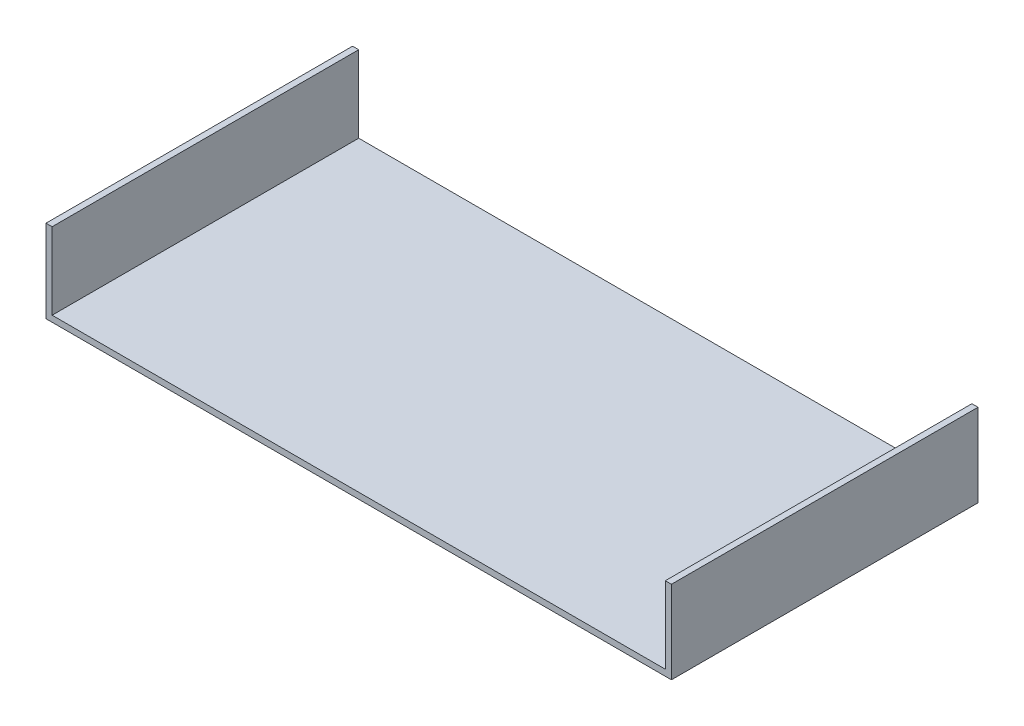
ISO-10303-21;
HEADER;
FILE_DESCRIPTION(('STEP AP214'),'2;1');
FILE_NAME('part.step','',(''),(''),'','','');
FILE_SCHEMA(('AUTOMOTIVE_DESIGN { 1 0 10303 214 1 1 1 1 }'));
ENDSEC;
DATA;
#1=APPLICATION_CONTEXT('core data for automotive mechanical design processes');
#2=APPLICATION_PROTOCOL_DEFINITION('international standard','automotive_design',2000,#1);
#3=PRODUCT_CONTEXT('',#1,'mechanical');
#4=PRODUCT('Part','Part','',(#3));
#5=PRODUCT_RELATED_PRODUCT_CATEGORY('part','',(#4));
#6=PRODUCT_DEFINITION_FORMATION('','',#4);
#7=PRODUCT_DEFINITION_CONTEXT('part definition',#1,'design');
#8=PRODUCT_DEFINITION('design','',#6,#7);
#9=PRODUCT_DEFINITION_SHAPE('','',#8);
#10=(LENGTH_UNIT() NAMED_UNIT(*) SI_UNIT(.MILLI.,.METRE.));
#11=(NAMED_UNIT(*) PLANE_ANGLE_UNIT() SI_UNIT($,.RADIAN.));
#12=(NAMED_UNIT(*) SI_UNIT($,.STERADIAN.) SOLID_ANGLE_UNIT());
#13=UNCERTAINTY_MEASURE_WITH_UNIT(LENGTH_MEASURE(1.E-05),#10,'distance_accuracy_value','');
#14=(GEOMETRIC_REPRESENTATION_CONTEXT(3) GLOBAL_UNCERTAINTY_ASSIGNED_CONTEXT((#13)) GLOBAL_UNIT_ASSIGNED_CONTEXT((#10,
#11,#12)) REPRESENTATION_CONTEXT('',''));
#15=CARTESIAN_POINT('',(0.,0.,0.));
#16=DIRECTION('',(0.,0.,1.));
#17=DIRECTION('',(1.,0.,0.));
#18=AXIS2_PLACEMENT_3D('',#15,#16,#17);
#19=CARTESIAN_POINT('',(-200.,0.,-10000.));
#20=DIRECTION('',(0.,1.,0.));
#21=DIRECTION('',(0.,0.,1.));
#22=AXIS2_PLACEMENT_3D('',#19,#20,#21);
#23=PLANE('',#22);
#24=DIRECTION('',(-1.,0.,0.));
#25=VECTOR('',#24,1.);
#26=CARTESIAN_POINT('',(-200.,0.,0.));
#27=LINE('',#26,#25);
#28=CARTESIAN_POINT('',(0.,0.,0.));
#29=VERTEX_POINT('',#28);
#30=CARTESIAN_POINT('',(-200.,0.,0.));
#31=VERTEX_POINT('',#30);
#32=EDGE_CURVE('E146',#29,#31,#27,.T.);
#33=ORIENTED_EDGE('',*,*,#32,.F.);
#34=DIRECTION('',(0.,0.,1.));
#35=VECTOR('',#34,1.);
#36=CARTESIAN_POINT('',(0.,0.,-10000.));
#37=LINE('',#36,#35);
#38=CARTESIAN_POINT('',(0.,0.,-10000.));
#39=VERTEX_POINT('',#38);
#40=EDGE_CURVE('E11',#39,#29,#37,.T.);
#41=ORIENTED_EDGE('',*,*,#40,.F.);
#42=DIRECTION('',(-1.,0.,0.));
#43=VECTOR('',#42,1.);
#44=CARTESIAN_POINT('',(-200.,0.,-10000.));
#45=LINE('',#44,#43);
#46=CARTESIAN_POINT('',(-200.,0.,-10000.));
#47=VERTEX_POINT('',#46);
#48=EDGE_CURVE('E174',#39,#47,#45,.T.);
#49=ORIENTED_EDGE('',*,*,#48,.T.);
#50=DIRECTION('',(0.,0.,1.));
#51=VECTOR('',#50,1.);
#52=CARTESIAN_POINT('',(-200.,0.,-10000.));
#53=LINE('',#52,#51);
#54=EDGE_CURVE('E46',#47,#31,#53,.T.);
#55=ORIENTED_EDGE('',*,*,#54,.T.);
#56=EDGE_LOOP('',(#33,#41,#49,#55));
#57=FACE_BOUND('',#56,.T.);
#58=ADVANCED_FACE('F43',(#57),#23,.T.);
#59=CARTESIAN_POINT('',(0.,0.,-10000.));
#60=DIRECTION('',(1.,0.,0.));
#61=DIRECTION('',(0.,1.,0.));
#62=AXIS2_PLACEMENT_3D('',#59,#60,#61);
#63=PLANE('',#62);
#64=DIRECTION('',(0.,1.,0.));
#65=VECTOR('',#64,1.);
#66=CARTESIAN_POINT('',(0.,0.,0.));
#67=LINE('',#66,#65);
#68=CARTESIAN_POINT('',(3.06161699786838E-13,-2500.,0.));
#69=VERTEX_POINT('',#68);
#70=EDGE_CURVE('E171',#69,#29,#67,.T.);
#71=ORIENTED_EDGE('',*,*,#70,.F.);
#72=DIRECTION('',(0.,0.,1.));
#73=VECTOR('',#72,1.);
#74=CARTESIAN_POINT('',(3.06161699786838E-13,-2500.,-10000.));
#75=LINE('',#74,#73);
#76=CARTESIAN_POINT('',(3.06161699786838E-13,-2500.,-10000.));
#77=VERTEX_POINT('',#76);
#78=EDGE_CURVE('E53',#77,#69,#75,.T.);
#79=ORIENTED_EDGE('',*,*,#78,.F.);
#80=DIRECTION('',(0.,1.,0.));
#81=VECTOR('',#80,1.);
#82=CARTESIAN_POINT('',(0.,0.,-10000.));
#83=LINE('',#82,#81);
#84=EDGE_CURVE('E132',#77,#39,#83,.T.);
#85=ORIENTED_EDGE('',*,*,#84,.T.);
#86=ORIENTED_EDGE('',*,*,#40,.T.);
#87=EDGE_LOOP('',(#71,#79,#85,#86));
#88=FACE_BOUND('',#87,.T.);
#89=ADVANCED_FACE('F192',(#88),#63,.T.);
#90=CARTESIAN_POINT('',(3.06161699786838E-13,-2500.,-10000.));
#91=DIRECTION('',(0.,1.,0.));
#92=DIRECTION('',(0.,0.,1.));
#93=AXIS2_PLACEMENT_3D('',#90,#91,#92);
#94=PLANE('',#93);
#95=DIRECTION('',(-1.,0.,0.));
#96=VECTOR('',#95,1.);
#97=CARTESIAN_POINT('',(3.06161699786838E-13,-2500.,0.));
#98=LINE('',#97,#96);
#99=CARTESIAN_POINT('',(20000.,-2500.,0.));
#100=VERTEX_POINT('',#99);
#101=EDGE_CURVE('E118',#100,#69,#98,.T.);
#102=ORIENTED_EDGE('',*,*,#101,.F.);
#103=DIRECTION('',(0.,0.,1.));
#104=VECTOR('',#103,1.);
#105=CARTESIAN_POINT('',(20000.,-2500.,-10000.));
#106=LINE('',#105,#104);
#107=CARTESIAN_POINT('',(20000.,-2500.,-10000.));
#108=VERTEX_POINT('',#107);
#109=EDGE_CURVE('E113',#108,#100,#106,.T.);
#110=ORIENTED_EDGE('',*,*,#109,.F.);
#111=DIRECTION('',(-1.,0.,0.));
#112=VECTOR('',#111,1.);
#113=CARTESIAN_POINT('',(3.06161699786838E-13,-2500.,-10000.));
#114=LINE('',#113,#112);
#115=EDGE_CURVE('E116',#108,#77,#114,.T.);
#116=ORIENTED_EDGE('',*,*,#115,.T.);
#117=ORIENTED_EDGE('',*,*,#78,.T.);
#118=EDGE_LOOP('',(#102,#110,#116,#117));
#119=FACE_BOUND('',#118,.T.);
#120=ADVANCED_FACE('F115',(#119),#94,.T.);
#121=CARTESIAN_POINT('',(20000.,-2500.,-10000.));
#122=DIRECTION('',(-1.,0.,0.));
#123=DIRECTION('',(0.,0.,1.));
#124=AXIS2_PLACEMENT_3D('',#121,#122,#123);
#125=PLANE('',#124);
#126=DIRECTION('',(0.,-1.,0.));
#127=VECTOR('',#126,1.);
#128=CARTESIAN_POINT('',(20000.,-2500.,0.));
#129=LINE('',#128,#127);
#130=CARTESIAN_POINT('',(20000.,0.,0.));
#131=VERTEX_POINT('',#130);
#132=EDGE_CURVE('E166',#131,#100,#129,.T.);
#133=ORIENTED_EDGE('',*,*,#132,.F.);
#134=DIRECTION('',(0.,0.,1.));
#135=VECTOR('',#134,1.);
#136=CARTESIAN_POINT('',(20000.,0.,-10000.));
#137=LINE('',#136,#135);
#138=CARTESIAN_POINT('',(20000.,0.,-10000.));
#139=VERTEX_POINT('',#138);
#140=EDGE_CURVE('E124',#139,#131,#137,.T.);
#141=ORIENTED_EDGE('',*,*,#140,.F.);
#142=DIRECTION('',(0.,-1.,0.));
#143=VECTOR('',#142,1.);
#144=CARTESIAN_POINT('',(20000.,-2500.,-10000.));
#145=LINE('',#144,#143);
#146=EDGE_CURVE('E130',#139,#108,#145,.T.);
#147=ORIENTED_EDGE('',*,*,#146,.T.);
#148=ORIENTED_EDGE('',*,*,#109,.T.);
#149=EDGE_LOOP('',(#133,#141,#147,#148));
#150=FACE_BOUND('',#149,.T.);
#151=ADVANCED_FACE('F135',(#150),#125,.T.);
#152=CARTESIAN_POINT('',(20000.,0.,-10000.));
#153=DIRECTION('',(0.,1.,0.));
#154=DIRECTION('',(0.,0.,1.));
#155=AXIS2_PLACEMENT_3D('',#152,#153,#154);
#156=PLANE('',#155);
#157=DIRECTION('',(-1.,0.,0.));
#158=VECTOR('',#157,1.);
#159=CARTESIAN_POINT('',(20000.,0.,0.));
#160=LINE('',#159,#158);
#161=CARTESIAN_POINT('',(20200.,0.,0.));
#162=VERTEX_POINT('',#161);
#163=EDGE_CURVE('E162',#162,#131,#160,.T.);
#164=ORIENTED_EDGE('',*,*,#163,.F.);
#165=DIRECTION('',(0.,0.,1.));
#166=VECTOR('',#165,1.);
#167=CARTESIAN_POINT('',(20200.,0.,-10000.));
#168=LINE('',#167,#166);
#169=CARTESIAN_POINT('',(20200.,0.,-10000.));
#170=VERTEX_POINT('',#169);
#171=EDGE_CURVE('E180',#170,#162,#168,.T.);
#172=ORIENTED_EDGE('',*,*,#171,.F.);
#173=DIRECTION('',(-1.,0.,0.));
#174=VECTOR('',#173,1.);
#175=CARTESIAN_POINT('',(20000.,0.,-10000.));
#176=LINE('',#175,#174);
#177=EDGE_CURVE('E137',#170,#139,#176,.T.);
#178=ORIENTED_EDGE('',*,*,#177,.T.);
#179=ORIENTED_EDGE('',*,*,#140,.T.);
#180=EDGE_LOOP('',(#164,#172,#178,#179));
#181=FACE_BOUND('',#180,.T.);
#182=ADVANCED_FACE('F205',(#181),#156,.T.);
#183=CARTESIAN_POINT('',(20200.,-2700.,-10000.));
#184=DIRECTION('',(1.,0.,0.));
#185=DIRECTION('',(0.,0.,-1.));
#186=AXIS2_PLACEMENT_3D('',#183,#184,#185);
#187=PLANE('',#186);
#188=DIRECTION('',(0.,1.,0.));
#189=VECTOR('',#188,1.);
#190=CARTESIAN_POINT('',(20200.,-2700.,0.));
#191=LINE('',#190,#189);
#192=CARTESIAN_POINT('',(20200.,-2700.,0.));
#193=VERTEX_POINT('',#192);
#194=EDGE_CURVE('E158',#193,#162,#191,.T.);
#195=ORIENTED_EDGE('',*,*,#194,.F.);
#196=DIRECTION('',(0.,0.,1.));
#197=VECTOR('',#196,1.);
#198=CARTESIAN_POINT('',(20200.,-2700.,-10000.));
#199=LINE('',#198,#197);
#200=CARTESIAN_POINT('',(20200.,-2700.,-10000.));
#201=VERTEX_POINT('',#200);
#202=EDGE_CURVE('E183',#201,#193,#199,.T.);
#203=ORIENTED_EDGE('',*,*,#202,.F.);
#204=DIRECTION('',(0.,1.,0.));
#205=VECTOR('',#204,1.);
#206=CARTESIAN_POINT('',(20200.,-2700.,-10000.));
#207=LINE('',#206,#205);
#208=EDGE_CURVE('E140',#201,#170,#207,.T.);
#209=ORIENTED_EDGE('',*,*,#208,.T.);
#210=ORIENTED_EDGE('',*,*,#171,.T.);
#211=EDGE_LOOP('',(#195,#203,#209,#210));
#212=FACE_BOUND('',#211,.T.);
#213=ADVANCED_FACE('F208',(#212),#187,.T.);
#214=CARTESIAN_POINT('',(-199.999999999999,-2700.,-10000.));
#215=DIRECTION('',(0.,-1.,0.));
#216=DIRECTION('',(0.,0.,-1.));
#217=AXIS2_PLACEMENT_3D('',#214,#215,#216);
#218=PLANE('',#217);
#219=DIRECTION('',(1.,0.,0.));
#220=VECTOR('',#219,1.);
#221=CARTESIAN_POINT('',(-199.999999999999,-2700.,0.));
#222=LINE('',#221,#220);
#223=CARTESIAN_POINT('',(-199.999999999999,-2700.,0.));
#224=VERTEX_POINT('',#223);
#225=EDGE_CURVE('E154',#224,#193,#222,.T.);
#226=ORIENTED_EDGE('',*,*,#225,.F.);
#227=DIRECTION('',(0.,0.,1.));
#228=VECTOR('',#227,1.);
#229=CARTESIAN_POINT('',(-199.999999999999,-2700.,-10000.));
#230=LINE('',#229,#228);
#231=CARTESIAN_POINT('',(-199.999999999999,-2700.,-10000.));
#232=VERTEX_POINT('',#231);
#233=EDGE_CURVE('E185',#232,#224,#230,.T.);
#234=ORIENTED_EDGE('',*,*,#233,.F.);
#235=DIRECTION('',(1.,0.,0.));
#236=VECTOR('',#235,1.);
#237=CARTESIAN_POINT('',(-199.999999999999,-2700.,-10000.));
#238=LINE('',#237,#236);
#239=EDGE_CURVE('E303',#232,#201,#238,.T.);
#240=ORIENTED_EDGE('',*,*,#239,.T.);
#241=ORIENTED_EDGE('',*,*,#202,.T.);
#242=EDGE_LOOP('',(#226,#234,#240,#241));
#243=FACE_BOUND('',#242,.T.);
#244=ADVANCED_FACE('F212',(#243),#218,.T.);
#245=CARTESIAN_POINT('',(-200.,0.,-10000.));
#246=DIRECTION('',(-1.,0.,0.));
#247=DIRECTION('',(0.,-1.,0.));
#248=AXIS2_PLACEMENT_3D('',#245,#246,#247);
#249=PLANE('',#248);
#250=DIRECTION('',(0.,-1.,0.));
#251=VECTOR('',#250,1.);
#252=CARTESIAN_POINT('',(-200.,0.,0.));
#253=LINE('',#252,#251);
#254=EDGE_CURVE('E150',#31,#224,#253,.T.);
#255=ORIENTED_EDGE('',*,*,#254,.F.);
#256=ORIENTED_EDGE('',*,*,#54,.F.);
#257=DIRECTION('',(0.,-1.,0.));
#258=VECTOR('',#257,1.);
#259=CARTESIAN_POINT('',(-200.,0.,-10000.));
#260=LINE('',#259,#258);
#261=EDGE_CURVE('E306',#47,#232,#260,.T.);
#262=ORIENTED_EDGE('',*,*,#261,.T.);
#263=ORIENTED_EDGE('',*,*,#233,.T.);
#264=EDGE_LOOP('',(#255,#256,#262,#263));
#265=FACE_BOUND('',#264,.T.);
#266=ADVANCED_FACE('F189',(#265),#249,.T.);
#267=CARTESIAN_POINT('',(0.,0.,-10000.));
#268=DIRECTION('',(0.,0.,-1.));
#269=DIRECTION('',(-1.,0.,0.));
#270=AXIS2_PLACEMENT_3D('',#267,#268,#269);
#271=PLANE('',#270);
#272=ORIENTED_EDGE('',*,*,#48,.F.);
#273=ORIENTED_EDGE('',*,*,#84,.F.);
#274=ORIENTED_EDGE('',*,*,#115,.F.);
#275=ORIENTED_EDGE('',*,*,#146,.F.);
#276=ORIENTED_EDGE('',*,*,#177,.F.);
#277=ORIENTED_EDGE('',*,*,#208,.F.);
#278=ORIENTED_EDGE('',*,*,#239,.F.);
#279=ORIENTED_EDGE('',*,*,#261,.F.);
#280=EDGE_LOOP('',(#272,#273,#274,#275,#276,#277,#278,#279));
#281=FACE_BOUND('',#280,.T.);
#282=ADVANCED_FACE('F128',(#281),#271,.T.);
#283=CARTESIAN_POINT('',(0.,0.,0.));
#284=DIRECTION('',(0.,0.,-1.));
#285=DIRECTION('',(-1.,0.,0.));
#286=AXIS2_PLACEMENT_3D('',#283,#284,#285);
#287=PLANE('',#286);
#288=ORIENTED_EDGE('',*,*,#32,.T.);
#289=ORIENTED_EDGE('',*,*,#254,.T.);
#290=ORIENTED_EDGE('',*,*,#225,.T.);
#291=ORIENTED_EDGE('',*,*,#194,.T.);
#292=ORIENTED_EDGE('',*,*,#163,.T.);
#293=ORIENTED_EDGE('',*,*,#132,.T.);
#294=ORIENTED_EDGE('',*,*,#101,.T.);
#295=ORIENTED_EDGE('',*,*,#70,.T.);
#296=EDGE_LOOP('',(#288,#289,#290,#291,#292,#293,#294,#295));
#297=FACE_BOUND('',#296,.T.);
#298=ADVANCED_FACE('F191',(#297),#287,.F.);
#299=CLOSED_SHELL('',(#58,#89,#120,#151,#182,#213,#244,#266,#282,#298));
#300=MANIFOLD_SOLID_BREP('B2',#299);
#301=ADVANCED_BREP_SHAPE_REPRESENTATION('',(#18,#300),#14);
#302=SHAPE_DEFINITION_REPRESENTATION(#9,#301);
ENDSEC;
END-ISO-10303-21;
